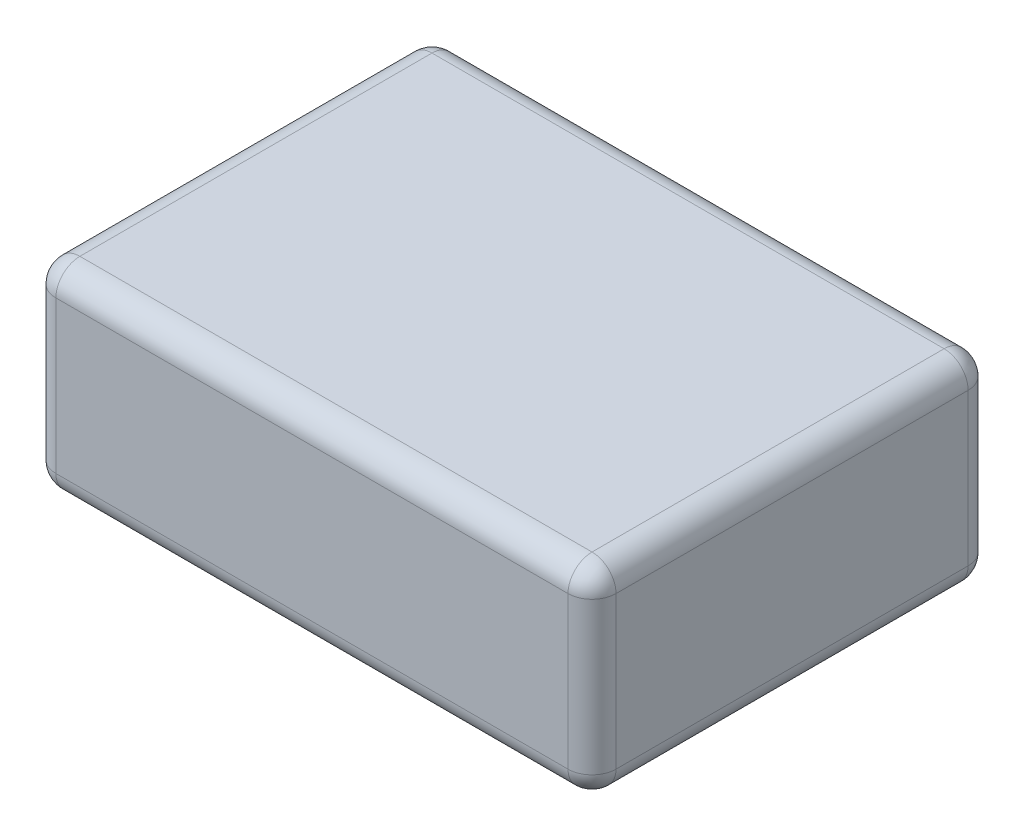
ISO-10303-21;
HEADER;
FILE_DESCRIPTION(('STEP AP214'),'2;1');
FILE_NAME('part.step','',(''),(''),'','','');
FILE_SCHEMA(('AUTOMOTIVE_DESIGN { 1 0 10303 214 1 1 1 1 }'));
ENDSEC;
DATA;
#1=APPLICATION_CONTEXT('core data for automotive mechanical design processes');
#2=APPLICATION_PROTOCOL_DEFINITION('international standard','automotive_design',2000,#1);
#3=PRODUCT_CONTEXT('',#1,'mechanical');
#4=PRODUCT('Part','Part','',(#3));
#5=PRODUCT_RELATED_PRODUCT_CATEGORY('part','',(#4));
#6=PRODUCT_DEFINITION_FORMATION('','',#4);
#7=PRODUCT_DEFINITION_CONTEXT('part definition',#1,'design');
#8=PRODUCT_DEFINITION('design','',#6,#7);
#9=PRODUCT_DEFINITION_SHAPE('','',#8);
#10=(LENGTH_UNIT() NAMED_UNIT(*) SI_UNIT(.MILLI.,.METRE.));
#11=(NAMED_UNIT(*) PLANE_ANGLE_UNIT() SI_UNIT($,.RADIAN.));
#12=(NAMED_UNIT(*) SI_UNIT($,.STERADIAN.) SOLID_ANGLE_UNIT());
#13=UNCERTAINTY_MEASURE_WITH_UNIT(LENGTH_MEASURE(1.E-05),#10,'distance_accuracy_value','');
#14=(GEOMETRIC_REPRESENTATION_CONTEXT(3) GLOBAL_UNCERTAINTY_ASSIGNED_CONTEXT((#13)) GLOBAL_UNIT_ASSIGNED_CONTEXT((#10,
#11,#12)) REPRESENTATION_CONTEXT('',''));
#15=CARTESIAN_POINT('',(0.,0.,0.));
#16=DIRECTION('',(0.,0.,1.));
#17=DIRECTION('',(1.,0.,0.));
#18=AXIS2_PLACEMENT_3D('',#15,#16,#17);
#19=CARTESIAN_POINT('',(88.9,63.5,-63.5));
#20=DIRECTION('',(-1.,0.,0.));
#21=DIRECTION('',(0.,0.,1.));
#22=AXIS2_PLACEMENT_3D('',#19,#20,#21);
#23=PLANE('',#22);
#24=DIRECTION('',(0.,-1.,0.));
#25=VECTOR('',#24,1.);
#26=CARTESIAN_POINT('',(88.9,63.5,55.88));
#27=LINE('',#26,#25);
#28=CARTESIAN_POINT('',(88.9,55.88,55.88));
#29=VERTEX_POINT('',#28);
#30=CARTESIAN_POINT('',(88.9,7.62,55.88));
#31=VERTEX_POINT('',#30);
#32=EDGE_CURVE('E180',#29,#31,#27,.T.);
#33=ORIENTED_EDGE('',*,*,#32,.T.);
#34=DIRECTION('',(0.,0.,-1.));
#35=VECTOR('',#34,1.);
#36=CARTESIAN_POINT('',(88.9,7.62,-63.5));
#37=LINE('',#36,#35);
#38=CARTESIAN_POINT('',(88.9,7.62,-55.88));
#39=VERTEX_POINT('',#38);
#40=EDGE_CURVE('E214',#31,#39,#37,.T.);
#41=ORIENTED_EDGE('',*,*,#40,.T.);
#42=DIRECTION('',(0.,-1.,0.));
#43=VECTOR('',#42,1.);
#44=CARTESIAN_POINT('',(88.9,63.5,-55.88));
#45=LINE('',#44,#43);
#46=CARTESIAN_POINT('',(88.9,55.88,-55.88));
#47=VERTEX_POINT('',#46);
#48=EDGE_CURVE('E212',#39,#47,#45,.F.);
#49=ORIENTED_EDGE('',*,*,#48,.T.);
#50=DIRECTION('',(0.,0.,-1.));
#51=VECTOR('',#50,1.);
#52=CARTESIAN_POINT('',(88.9,55.88,55.88));
#53=LINE('',#52,#51);
#54=EDGE_CURVE('E183',#47,#29,#53,.F.);
#55=ORIENTED_EDGE('',*,*,#54,.T.);
#56=EDGE_LOOP('',(#33,#41,#49,#55));
#57=FACE_BOUND('',#56,.T.);
#58=ADVANCED_FACE('F37',(#57),#23,.F.);
#59=CARTESIAN_POINT('',(-88.9,63.5,-63.5));
#60=DIRECTION('',(0.,0.,1.));
#61=DIRECTION('',(1.,0.,0.));
#62=AXIS2_PLACEMENT_3D('',#59,#60,#61);
#63=PLANE('',#62);
#64=DIRECTION('',(0.,-1.,0.));
#65=VECTOR('',#64,1.);
#66=CARTESIAN_POINT('',(81.28,63.5,-63.5));
#67=LINE('',#66,#65);
#68=CARTESIAN_POINT('',(81.28,55.88,-63.5));
#69=VERTEX_POINT('',#68);
#70=CARTESIAN_POINT('',(81.28,7.62,-63.5));
#71=VERTEX_POINT('',#70);
#72=EDGE_CURVE('E62',#69,#71,#67,.T.);
#73=ORIENTED_EDGE('',*,*,#72,.T.);
#74=DIRECTION('',(-1.,0.,0.));
#75=VECTOR('',#74,1.);
#76=CARTESIAN_POINT('',(-88.9,7.62,-63.5));
#77=LINE('',#76,#75);
#78=CARTESIAN_POINT('',(-81.28,7.62,-63.5));
#79=VERTEX_POINT('',#78);
#80=EDGE_CURVE('E46',#71,#79,#77,.T.);
#81=ORIENTED_EDGE('',*,*,#80,.T.);
#82=DIRECTION('',(0.,-1.,0.));
#83=VECTOR('',#82,1.);
#84=CARTESIAN_POINT('',(-81.28,63.5,-63.5));
#85=LINE('',#84,#83);
#86=CARTESIAN_POINT('',(-81.28,55.88,-63.5));
#87=VERTEX_POINT('',#86);
#88=EDGE_CURVE('E219',#79,#87,#85,.F.);
#89=ORIENTED_EDGE('',*,*,#88,.T.);
#90=DIRECTION('',(-1.,0.,0.));
#91=VECTOR('',#90,1.);
#92=CARTESIAN_POINT('',(81.28,55.88,-63.5));
#93=LINE('',#92,#91);
#94=EDGE_CURVE('E216',#87,#69,#93,.F.);
#95=ORIENTED_EDGE('',*,*,#94,.T.);
#96=EDGE_LOOP('',(#73,#81,#89,#95));
#97=FACE_BOUND('',#96,.T.);
#98=ADVANCED_FACE('F327',(#97),#63,.F.);
#99=CARTESIAN_POINT('',(-88.9,63.5,-63.5));
#100=DIRECTION('',(1.,0.,0.));
#101=DIRECTION('',(0.,0.,-1.));
#102=AXIS2_PLACEMENT_3D('',#99,#100,#101);
#103=PLANE('',#102);
#104=DIRECTION('',(0.,-1.,0.));
#105=VECTOR('',#104,1.);
#106=CARTESIAN_POINT('',(-88.9,63.5,-55.88));
#107=LINE('',#106,#105);
#108=CARTESIAN_POINT('',(-88.9,55.88,-55.88));
#109=VERTEX_POINT('',#108);
#110=CARTESIAN_POINT('',(-88.9,7.62,-55.88));
#111=VERTEX_POINT('',#110);
#112=EDGE_CURVE('E197',#109,#111,#107,.T.);
#113=ORIENTED_EDGE('',*,*,#112,.T.);
#114=DIRECTION('',(0.,0.,1.));
#115=VECTOR('',#114,1.);
#116=CARTESIAN_POINT('',(-88.9,7.62,-63.5));
#117=LINE('',#116,#115);
#118=CARTESIAN_POINT('',(-88.8999999999999,7.62,55.88));
#119=VERTEX_POINT('',#118);
#120=EDGE_CURVE('E199',#111,#119,#117,.T.);
#121=ORIENTED_EDGE('',*,*,#120,.T.);
#122=DIRECTION('',(0.,-1.,0.));
#123=VECTOR('',#122,1.);
#124=CARTESIAN_POINT('',(-88.8999999999999,63.5,55.88));
#125=LINE('',#124,#123);
#126=CARTESIAN_POINT('',(-88.8999999999999,55.88,55.88));
#127=VERTEX_POINT('',#126);
#128=EDGE_CURVE('E167',#119,#127,#125,.F.);
#129=ORIENTED_EDGE('',*,*,#128,.T.);
#130=DIRECTION('',(0.,0.,1.));
#131=VECTOR('',#130,1.);
#132=CARTESIAN_POINT('',(-88.9,55.88,-63.5));
#133=LINE('',#132,#131);
#134=EDGE_CURVE('E164',#127,#109,#133,.F.);
#135=ORIENTED_EDGE('',*,*,#134,.T.);
#136=EDGE_LOOP('',(#113,#121,#129,#135));
#137=FACE_BOUND('',#136,.T.);
#138=ADVANCED_FACE('F287',(#137),#103,.F.);
#139=CARTESIAN_POINT('',(-88.8999999999999,63.5,63.5));
#140=DIRECTION('',(0.,0.,-1.));
#141=DIRECTION('',(-1.,0.,0.));
#142=AXIS2_PLACEMENT_3D('',#139,#140,#141);
#143=PLANE('',#142);
#144=DIRECTION('',(0.,-1.,0.));
#145=VECTOR('',#144,1.);
#146=CARTESIAN_POINT('',(-81.2799999999999,63.5,63.5));
#147=LINE('',#146,#145);
#148=CARTESIAN_POINT('',(-81.2799999999999,55.88,63.5));
#149=VERTEX_POINT('',#148);
#150=CARTESIAN_POINT('',(-81.2799999999999,7.62,63.5));
#151=VERTEX_POINT('',#150);
#152=EDGE_CURVE('E134',#149,#151,#147,.T.);
#153=ORIENTED_EDGE('',*,*,#152,.T.);
#154=DIRECTION('',(1.,0.,0.));
#155=VECTOR('',#154,1.);
#156=CARTESIAN_POINT('',(-88.8999999999999,7.62,63.5));
#157=LINE('',#156,#155);
#158=CARTESIAN_POINT('',(81.28,7.62,63.5));
#159=VERTEX_POINT('',#158);
#160=EDGE_CURVE('E210',#151,#159,#157,.T.);
#161=ORIENTED_EDGE('',*,*,#160,.T.);
#162=DIRECTION('',(0.,-1.,0.));
#163=VECTOR('',#162,1.);
#164=CARTESIAN_POINT('',(81.28,63.5,63.5));
#165=LINE('',#164,#163);
#166=CARTESIAN_POINT('',(81.28,55.88,63.5));
#167=VERTEX_POINT('',#166);
#168=EDGE_CURVE('E136',#159,#167,#165,.F.);
#169=ORIENTED_EDGE('',*,*,#168,.T.);
#170=DIRECTION('',(1.,0.,0.));
#171=VECTOR('',#170,1.);
#172=CARTESIAN_POINT('',(-88.8999999999999,55.88,63.5));
#173=LINE('',#172,#171);
#174=EDGE_CURVE('E130',#167,#149,#173,.F.);
#175=ORIENTED_EDGE('',*,*,#174,.T.);
#176=EDGE_LOOP('',(#153,#161,#169,#175));
#177=FACE_BOUND('',#176,.T.);
#178=ADVANCED_FACE('F132',(#177),#143,.F.);
#179=CARTESIAN_POINT('',(0.,63.5,0.));
#180=DIRECTION('',(0.,1.,0.));
#181=DIRECTION('',(0.,0.,1.));
#182=AXIS2_PLACEMENT_3D('',#179,#180,#181);
#183=PLANE('',#182);
#184=DIRECTION('',(0.,0.,-1.));
#185=VECTOR('',#184,1.);
#186=CARTESIAN_POINT('',(81.28,63.5,-63.5));
#187=LINE('',#186,#185);
#188=CARTESIAN_POINT('',(81.28,63.5,55.88));
#189=VERTEX_POINT('',#188);
#190=CARTESIAN_POINT('',(81.28,63.5,-55.88));
#191=VERTEX_POINT('',#190);
#192=EDGE_CURVE('E177',#189,#191,#187,.T.);
#193=ORIENTED_EDGE('',*,*,#192,.T.);
#194=DIRECTION('',(-1.,0.,0.));
#195=VECTOR('',#194,1.);
#196=CARTESIAN_POINT('',(-81.28,63.5,-55.88));
#197=LINE('',#196,#195);
#198=CARTESIAN_POINT('',(-81.28,63.5,-55.88));
#199=VERTEX_POINT('',#198);
#200=EDGE_CURVE('E11',#191,#199,#197,.T.);
#201=ORIENTED_EDGE('',*,*,#200,.T.);
#202=DIRECTION('',(0.,0.,1.));
#203=VECTOR('',#202,1.);
#204=CARTESIAN_POINT('',(-81.2799999999999,63.5,63.5));
#205=LINE('',#204,#203);
#206=CARTESIAN_POINT('',(-81.2799999999999,63.5,55.88));
#207=VERTEX_POINT('',#206);
#208=EDGE_CURVE('E172',#199,#207,#205,.T.);
#209=ORIENTED_EDGE('',*,*,#208,.T.);
#210=DIRECTION('',(1.,0.,0.));
#211=VECTOR('',#210,1.);
#212=CARTESIAN_POINT('',(88.9,63.5,55.88));
#213=LINE('',#212,#211);
#214=EDGE_CURVE('E148',#207,#189,#213,.T.);
#215=ORIENTED_EDGE('',*,*,#214,.T.);
#216=EDGE_LOOP('',(#193,#201,#209,#215));
#217=FACE_BOUND('',#216,.T.);
#218=ADVANCED_FACE('F271',(#217),#183,.T.);
#219=CARTESIAN_POINT('',(0.,0.,0.));
#220=DIRECTION('',(0.,1.,0.));
#221=DIRECTION('',(0.,0.,1.));
#222=AXIS2_PLACEMENT_3D('',#219,#220,#221);
#223=PLANE('',#222);
#224=DIRECTION('',(1.,0.,0.));
#225=VECTOR('',#224,1.);
#226=CARTESIAN_POINT('',(0.,0.,55.88));
#227=LINE('',#226,#225);
#228=CARTESIAN_POINT('',(81.28,0.,55.88));
#229=VERTEX_POINT('',#228);
#230=CARTESIAN_POINT('',(-81.2799999999999,0.,55.88));
#231=VERTEX_POINT('',#230);
#232=EDGE_CURVE('E205',#229,#231,#227,.F.);
#233=ORIENTED_EDGE('',*,*,#232,.T.);
#234=DIRECTION('',(0.,0.,1.));
#235=VECTOR('',#234,1.);
#236=CARTESIAN_POINT('',(-81.28,0.,0.));
#237=LINE('',#236,#235);
#238=CARTESIAN_POINT('',(-81.28,0.,-55.88));
#239=VERTEX_POINT('',#238);
#240=EDGE_CURVE('E207',#231,#239,#237,.F.);
#241=ORIENTED_EDGE('',*,*,#240,.T.);
#242=DIRECTION('',(-1.,0.,0.));
#243=VECTOR('',#242,1.);
#244=CARTESIAN_POINT('',(0.,0.,-55.88));
#245=LINE('',#244,#243);
#246=CARTESIAN_POINT('',(81.28,0.,-55.88));
#247=VERTEX_POINT('',#246);
#248=EDGE_CURVE('E201',#239,#247,#245,.F.);
#249=ORIENTED_EDGE('',*,*,#248,.T.);
#250=DIRECTION('',(0.,0.,-1.));
#251=VECTOR('',#250,1.);
#252=CARTESIAN_POINT('',(81.28,0.,0.));
#253=LINE('',#252,#251);
#254=EDGE_CURVE('E203',#247,#229,#253,.F.);
#255=ORIENTED_EDGE('',*,*,#254,.T.);
#256=EDGE_LOOP('',(#233,#241,#249,#255));
#257=FACE_BOUND('',#256,.T.);
#258=ADVANCED_FACE('F341',(#257),#223,.F.);
#259=CARTESIAN_POINT('',(-81.28,55.88,0.));
#260=DIRECTION('',(0.,0.,-1.));
#261=DIRECTION('',(-1.,0.,0.));
#262=AXIS2_PLACEMENT_3D('',#259,#260,#261);
#263=CYLINDRICAL_SURFACE('',#262,7.62);
#264=ORIENTED_EDGE('',*,*,#208,.F.);
#265=CARTESIAN_POINT('',(-81.28,55.88,-55.88));
#266=DIRECTION('',(0.,0.,-1.));
#267=DIRECTION('',(-1.,0.,0.));
#268=AXIS2_PLACEMENT_3D('',#265,#266,#267);
#269=CIRCLE('',#268,7.62);
#270=EDGE_CURVE('E195',#199,#109,#269,.F.);
#271=ORIENTED_EDGE('',*,*,#270,.T.);
#272=ORIENTED_EDGE('',*,*,#134,.F.);
#273=CARTESIAN_POINT('',(-81.2799999999999,55.88,55.88));
#274=DIRECTION('',(0.,0.,1.));
#275=DIRECTION('',(1.,0.,0.));
#276=AXIS2_PLACEMENT_3D('',#273,#274,#275);
#277=CIRCLE('',#276,7.62);
#278=EDGE_CURVE('E140',#207,#127,#277,.T.);
#279=ORIENTED_EDGE('',*,*,#278,.F.);
#280=EDGE_LOOP('',(#264,#271,#272,#279));
#281=FACE_BOUND('',#280,.T.);
#282=ADVANCED_FACE('F275',(#281),#263,.T.);
#283=CARTESIAN_POINT('',(0.,55.88,55.88));
#284=DIRECTION('',(-1.,0.,0.));
#285=DIRECTION('',(0.,0.,1.));
#286=AXIS2_PLACEMENT_3D('',#283,#284,#285);
#287=CYLINDRICAL_SURFACE('',#286,7.62);
#288=ORIENTED_EDGE('',*,*,#174,.F.);
#289=CARTESIAN_POINT('',(81.28,55.88,55.88));
#290=DIRECTION('',(-1.,0.,0.));
#291=DIRECTION('',(0.,0.,1.));
#292=AXIS2_PLACEMENT_3D('',#289,#290,#291);
#293=CIRCLE('',#292,7.62);
#294=EDGE_CURVE('E173',#167,#189,#293,.T.);
#295=ORIENTED_EDGE('',*,*,#294,.T.);
#296=ORIENTED_EDGE('',*,*,#214,.F.);
#297=CARTESIAN_POINT('',(-81.2799999999999,55.88,55.88));
#298=DIRECTION('',(-1.,0.,0.));
#299=DIRECTION('',(0.,0.,1.));
#300=AXIS2_PLACEMENT_3D('',#297,#298,#299);
#301=CIRCLE('',#300,7.62);
#302=EDGE_CURVE('E144',#149,#207,#301,.T.);
#303=ORIENTED_EDGE('',*,*,#302,.F.);
#304=EDGE_LOOP('',(#288,#295,#296,#303));
#305=FACE_BOUND('',#304,.T.);
#306=ADVANCED_FACE('F146',(#305),#287,.T.);
#307=CARTESIAN_POINT('',(-81.2799999999999,55.88,55.88));
#308=DIRECTION('',(0.,1.,0.));
#309=DIRECTION('',(0.,0.,1.));
#310=AXIS2_PLACEMENT_3D('',#307,#308,#309);
#311=SPHERICAL_SURFACE('',#310,7.62);
#312=ORIENTED_EDGE('',*,*,#302,.T.);
#313=ORIENTED_EDGE('',*,*,#278,.T.);
#314=CARTESIAN_POINT('',(-81.2799999999999,55.88,55.88));
#315=DIRECTION('',(0.,1.,0.));
#316=DIRECTION('',(0.,0.,1.));
#317=AXIS2_PLACEMENT_3D('',#314,#315,#316);
#318=CIRCLE('',#317,7.62);
#319=EDGE_CURVE('E152',#149,#127,#318,.F.);
#320=ORIENTED_EDGE('',*,*,#319,.F.);
#321=EDGE_LOOP('',(#312,#313,#320));
#322=FACE_BOUND('',#321,.T.);
#323=ADVANCED_FACE('F155',(#322),#311,.T.);
#324=CARTESIAN_POINT('',(-81.2799999999999,63.5,55.88));
#325=DIRECTION('',(0.,-1.,0.));
#326=DIRECTION('',(0.,0.,-1.));
#327=AXIS2_PLACEMENT_3D('',#324,#325,#326);
#328=CYLINDRICAL_SURFACE('',#327,7.62);
#329=ORIENTED_EDGE('',*,*,#128,.F.);
#330=CARTESIAN_POINT('',(-81.2799999999999,7.62,55.88));
#331=DIRECTION('',(0.,-1.,0.));
#332=DIRECTION('',(0.,0.,-1.));
#333=AXIS2_PLACEMENT_3D('',#330,#331,#332);
#334=CIRCLE('',#333,7.62);
#335=EDGE_CURVE('E163',#119,#151,#334,.F.);
#336=ORIENTED_EDGE('',*,*,#335,.T.);
#337=ORIENTED_EDGE('',*,*,#152,.F.);
#338=ORIENTED_EDGE('',*,*,#319,.T.);
#339=EDGE_LOOP('',(#329,#336,#337,#338));
#340=FACE_BOUND('',#339,.T.);
#341=ADVANCED_FACE('F161',(#340),#328,.T.);
#342=CARTESIAN_POINT('',(81.28,55.88,0.));
#343=DIRECTION('',(0.,0.,1.));
#344=DIRECTION('',(1.,0.,0.));
#345=AXIS2_PLACEMENT_3D('',#342,#343,#344);
#346=CYLINDRICAL_SURFACE('',#345,7.62);
#347=ORIENTED_EDGE('',*,*,#54,.F.);
#348=CARTESIAN_POINT('',(81.28,55.88,-55.88));
#349=DIRECTION('',(0.,0.,1.));
#350=DIRECTION('',(1.,0.,0.));
#351=AXIS2_PLACEMENT_3D('',#348,#349,#350);
#352=CIRCLE('',#351,7.62);
#353=EDGE_CURVE('E193',#47,#191,#352,.T.);
#354=ORIENTED_EDGE('',*,*,#353,.T.);
#355=ORIENTED_EDGE('',*,*,#192,.F.);
#356=CARTESIAN_POINT('',(81.28,55.88,55.88));
#357=DIRECTION('',(0.,0.,1.));
#358=DIRECTION('',(1.,0.,0.));
#359=AXIS2_PLACEMENT_3D('',#356,#357,#358);
#360=CIRCLE('',#359,7.62);
#361=EDGE_CURVE('E158',#29,#189,#360,.T.);
#362=ORIENTED_EDGE('',*,*,#361,.F.);
#363=EDGE_LOOP('',(#347,#354,#355,#362));
#364=FACE_BOUND('',#363,.T.);
#365=ADVANCED_FACE('F268',(#364),#346,.T.);
#366=CARTESIAN_POINT('',(81.28,63.5,55.88));
#367=DIRECTION('',(0.,-1.,0.));
#368=DIRECTION('',(0.,0.,-1.));
#369=AXIS2_PLACEMENT_3D('',#366,#367,#368);
#370=CYLINDRICAL_SURFACE('',#369,7.62);
#371=ORIENTED_EDGE('',*,*,#168,.F.);
#372=CARTESIAN_POINT('',(81.28,7.62,55.88));
#373=DIRECTION('',(0.,-1.,0.));
#374=DIRECTION('',(0.,0.,-1.));
#375=AXIS2_PLACEMENT_3D('',#372,#373,#374);
#376=CIRCLE('',#375,7.62);
#377=EDGE_CURVE('E191',#159,#31,#376,.F.);
#378=ORIENTED_EDGE('',*,*,#377,.T.);
#379=ORIENTED_EDGE('',*,*,#32,.F.);
#380=CARTESIAN_POINT('',(81.28,55.88,55.88));
#381=DIRECTION('',(0.,1.,0.));
#382=DIRECTION('',(0.,0.,1.));
#383=AXIS2_PLACEMENT_3D('',#380,#381,#382);
#384=CIRCLE('',#383,7.62);
#385=EDGE_CURVE('E186',#167,#29,#384,.T.);
#386=ORIENTED_EDGE('',*,*,#385,.F.);
#387=EDGE_LOOP('',(#371,#378,#379,#386));
#388=FACE_BOUND('',#387,.T.);
#389=ADVANCED_FACE('F305',(#388),#370,.T.);
#390=CARTESIAN_POINT('',(81.28,55.88,55.88));
#391=DIRECTION('',(-1.,0.,0.));
#392=DIRECTION('',(0.,0.,1.));
#393=AXIS2_PLACEMENT_3D('',#390,#391,#392);
#394=SPHERICAL_SURFACE('',#393,7.62);
#395=ORIENTED_EDGE('',*,*,#361,.T.);
#396=ORIENTED_EDGE('',*,*,#294,.F.);
#397=ORIENTED_EDGE('',*,*,#385,.T.);
#398=EDGE_LOOP('',(#395,#396,#397));
#399=FACE_BOUND('',#398,.T.);
#400=ADVANCED_FACE('F317',(#399),#394,.T.);
#401=CARTESIAN_POINT('',(81.28,55.88,-55.88));
#402=DIRECTION('',(0.,0.,1.));
#403=DIRECTION('',(1.,0.,0.));
#404=AXIS2_PLACEMENT_3D('',#401,#402,#403);
#405=SPHERICAL_SURFACE('',#404,7.62);
#406=CARTESIAN_POINT('',(81.28,55.88,-55.88));
#407=DIRECTION('',(-1.,0.,0.));
#408=DIRECTION('',(0.,0.,1.));
#409=AXIS2_PLACEMENT_3D('',#406,#407,#408);
#410=CIRCLE('',#409,7.62);
#411=EDGE_CURVE('E252',#191,#69,#410,.T.);
#412=ORIENTED_EDGE('',*,*,#411,.F.);
#413=ORIENTED_EDGE('',*,*,#353,.F.);
#414=CARTESIAN_POINT('',(81.28,55.88,-55.88));
#415=DIRECTION('',(0.,-1.,0.));
#416=DIRECTION('',(0.,0.,-1.));
#417=AXIS2_PLACEMENT_3D('',#414,#415,#416);
#418=CIRCLE('',#417,7.62);
#419=EDGE_CURVE('E41',#69,#47,#418,.T.);
#420=ORIENTED_EDGE('',*,*,#419,.F.);
#421=EDGE_LOOP('',(#412,#413,#420));
#422=FACE_BOUND('',#421,.T.);
#423=ADVANCED_FACE('F39',(#422),#405,.T.);
#424=CARTESIAN_POINT('',(81.28,63.5,-55.88));
#425=DIRECTION('',(0.,-1.,0.));
#426=DIRECTION('',(0.,0.,-1.));
#427=AXIS2_PLACEMENT_3D('',#424,#425,#426);
#428=CYLINDRICAL_SURFACE('',#427,7.62);
#429=ORIENTED_EDGE('',*,*,#419,.T.);
#430=ORIENTED_EDGE('',*,*,#48,.F.);
#431=CARTESIAN_POINT('',(81.28,7.62,-55.88));
#432=DIRECTION('',(0.,-1.,0.));
#433=DIRECTION('',(0.,0.,-1.));
#434=AXIS2_PLACEMENT_3D('',#431,#432,#433);
#435=CIRCLE('',#434,7.62);
#436=EDGE_CURVE('E250',#71,#39,#435,.T.);
#437=ORIENTED_EDGE('',*,*,#436,.F.);
#438=ORIENTED_EDGE('',*,*,#72,.F.);
#439=EDGE_LOOP('',(#429,#430,#437,#438));
#440=FACE_BOUND('',#439,.T.);
#441=ADVANCED_FACE('F262',(#440),#428,.T.);
#442=CARTESIAN_POINT('',(0.,55.88,-55.88));
#443=DIRECTION('',(1.,0.,0.));
#444=DIRECTION('',(0.,0.,-1.));
#445=AXIS2_PLACEMENT_3D('',#442,#443,#444);
#446=CYLINDRICAL_SURFACE('',#445,7.62);
#447=ORIENTED_EDGE('',*,*,#411,.T.);
#448=ORIENTED_EDGE('',*,*,#94,.F.);
#449=CARTESIAN_POINT('',(-81.28,55.88,-55.88));
#450=DIRECTION('',(-1.,0.,0.));
#451=DIRECTION('',(0.,0.,1.));
#452=AXIS2_PLACEMENT_3D('',#449,#450,#451);
#453=CIRCLE('',#452,7.62);
#454=EDGE_CURVE('E247',#199,#87,#453,.T.);
#455=ORIENTED_EDGE('',*,*,#454,.F.);
#456=ORIENTED_EDGE('',*,*,#200,.F.);
#457=EDGE_LOOP('',(#447,#448,#455,#456));
#458=FACE_BOUND('',#457,.T.);
#459=ADVANCED_FACE('F278',(#458),#446,.T.);
#460=CARTESIAN_POINT('',(81.28,7.62,-55.88));
#461=DIRECTION('',(1.,0.,0.));
#462=DIRECTION('',(0.,1.,0.));
#463=AXIS2_PLACEMENT_3D('',#460,#461,#462);
#464=SPHERICAL_SURFACE('',#463,7.62);
#465=CARTESIAN_POINT('',(81.28,7.62,-55.88));
#466=DIRECTION('',(1.,0.,0.));
#467=DIRECTION('',(0.,0.,-1.));
#468=AXIS2_PLACEMENT_3D('',#465,#466,#467);
#469=CIRCLE('',#468,7.62);
#470=EDGE_CURVE('E241',#71,#247,#469,.F.);
#471=ORIENTED_EDGE('',*,*,#470,.F.);
#472=ORIENTED_EDGE('',*,*,#436,.T.);
#473=CARTESIAN_POINT('',(81.28,7.62,-55.88));
#474=DIRECTION('',(0.,0.,-1.));
#475=DIRECTION('',(-1.,0.,0.));
#476=AXIS2_PLACEMENT_3D('',#473,#474,#475);
#477=CIRCLE('',#476,7.62);
#478=EDGE_CURVE('E244',#247,#39,#477,.F.);
#479=ORIENTED_EDGE('',*,*,#478,.F.);
#480=EDGE_LOOP('',(#471,#472,#479));
#481=FACE_BOUND('',#480,.T.);
#482=ADVANCED_FACE('F419',(#481),#464,.T.);
#483=CARTESIAN_POINT('',(-81.28,55.88,-55.88));
#484=DIRECTION('',(0.,0.,1.));
#485=DIRECTION('',(1.,0.,0.));
#486=AXIS2_PLACEMENT_3D('',#483,#484,#485);
#487=SPHERICAL_SURFACE('',#486,7.62);
#488=ORIENTED_EDGE('',*,*,#270,.F.);
#489=ORIENTED_EDGE('',*,*,#454,.T.);
#490=CARTESIAN_POINT('',(-81.28,55.88,-55.88));
#491=DIRECTION('',(0.,-1.,0.));
#492=DIRECTION('',(0.,0.,-1.));
#493=AXIS2_PLACEMENT_3D('',#490,#491,#492);
#494=CIRCLE('',#493,7.62);
#495=EDGE_CURVE('E238',#109,#87,#494,.T.);
#496=ORIENTED_EDGE('',*,*,#495,.F.);
#497=EDGE_LOOP('',(#488,#489,#496));
#498=FACE_BOUND('',#497,.T.);
#499=ADVANCED_FACE('F281',(#498),#487,.T.);
#500=CARTESIAN_POINT('',(81.28,7.62,-63.5));
#501=DIRECTION('',(0.,0.,-1.));
#502=DIRECTION('',(-1.,0.,0.));
#503=AXIS2_PLACEMENT_3D('',#500,#501,#502);
#504=CYLINDRICAL_SURFACE('',#503,7.62);
#505=ORIENTED_EDGE('',*,*,#478,.T.);
#506=ORIENTED_EDGE('',*,*,#40,.F.);
#507=CARTESIAN_POINT('',(81.28,7.62,55.88));
#508=DIRECTION('',(0.,0.,1.));
#509=DIRECTION('',(1.,0.,0.));
#510=AXIS2_PLACEMENT_3D('',#507,#508,#509);
#511=CIRCLE('',#510,7.62);
#512=EDGE_CURVE('E235',#229,#31,#511,.T.);
#513=ORIENTED_EDGE('',*,*,#512,.F.);
#514=ORIENTED_EDGE('',*,*,#254,.F.);
#515=EDGE_LOOP('',(#505,#506,#513,#514));
#516=FACE_BOUND('',#515,.T.);
#517=ADVANCED_FACE('F313',(#516),#504,.T.);
#518=CARTESIAN_POINT('',(-88.9,7.62,-55.88));
#519=DIRECTION('',(-1.,0.,0.));
#520=DIRECTION('',(0.,0.,1.));
#521=AXIS2_PLACEMENT_3D('',#518,#519,#520);
#522=CYLINDRICAL_SURFACE('',#521,7.62);
#523=ORIENTED_EDGE('',*,*,#470,.T.);
#524=ORIENTED_EDGE('',*,*,#248,.F.);
#525=CARTESIAN_POINT('',(-81.28,7.62,-55.88));
#526=DIRECTION('',(-1.,0.,0.));
#527=DIRECTION('',(0.,0.,1.));
#528=AXIS2_PLACEMENT_3D('',#525,#526,#527);
#529=CIRCLE('',#528,7.62);
#530=EDGE_CURVE('E233',#79,#239,#529,.T.);
#531=ORIENTED_EDGE('',*,*,#530,.F.);
#532=ORIENTED_EDGE('',*,*,#80,.F.);
#533=EDGE_LOOP('',(#523,#524,#531,#532));
#534=FACE_BOUND('',#533,.T.);
#535=ADVANCED_FACE('F446',(#534),#522,.T.);
#536=CARTESIAN_POINT('',(-81.28,63.5,-55.88));
#537=DIRECTION('',(0.,-1.,0.));
#538=DIRECTION('',(0.,0.,-1.));
#539=AXIS2_PLACEMENT_3D('',#536,#537,#538);
#540=CYLINDRICAL_SURFACE('',#539,7.62);
#541=ORIENTED_EDGE('',*,*,#495,.T.);
#542=ORIENTED_EDGE('',*,*,#88,.F.);
#543=CARTESIAN_POINT('',(-81.28,7.62,-55.88));
#544=DIRECTION('',(0.,-1.,0.));
#545=DIRECTION('',(0.,0.,-1.));
#546=AXIS2_PLACEMENT_3D('',#543,#544,#545);
#547=CIRCLE('',#546,7.62);
#548=EDGE_CURVE('E54',#111,#79,#547,.T.);
#549=ORIENTED_EDGE('',*,*,#548,.F.);
#550=ORIENTED_EDGE('',*,*,#112,.F.);
#551=EDGE_LOOP('',(#541,#542,#549,#550));
#552=FACE_BOUND('',#551,.T.);
#553=ADVANCED_FACE('F285',(#552),#540,.T.);
#554=CARTESIAN_POINT('',(81.28,7.62,55.88));
#555=DIRECTION('',(0.,1.,0.));
#556=DIRECTION('',(0.,0.,1.));
#557=AXIS2_PLACEMENT_3D('',#554,#555,#556);
#558=SPHERICAL_SURFACE('',#557,7.62);
#559=ORIENTED_EDGE('',*,*,#512,.T.);
#560=ORIENTED_EDGE('',*,*,#377,.F.);
#561=CARTESIAN_POINT('',(81.28,7.62,55.88));
#562=DIRECTION('',(-1.,0.,0.));
#563=DIRECTION('',(0.,0.,1.));
#564=AXIS2_PLACEMENT_3D('',#561,#562,#563);
#565=CIRCLE('',#564,7.62);
#566=EDGE_CURVE('E229',#229,#159,#565,.T.);
#567=ORIENTED_EDGE('',*,*,#566,.F.);
#568=EDGE_LOOP('',(#559,#560,#567));
#569=FACE_BOUND('',#568,.T.);
#570=ADVANCED_FACE('F308',(#569),#558,.T.);
#571=CARTESIAN_POINT('',(-81.28,7.62,-55.88));
#572=DIRECTION('',(0.,0.,-1.));
#573=DIRECTION('',(0.,1.,0.));
#574=AXIS2_PLACEMENT_3D('',#571,#572,#573);
#575=SPHERICAL_SURFACE('',#574,7.62);
#576=ORIENTED_EDGE('',*,*,#548,.T.);
#577=ORIENTED_EDGE('',*,*,#530,.T.);
#578=CARTESIAN_POINT('',(-81.28,7.62,-55.88));
#579=DIRECTION('',(0.,0.,-1.));
#580=DIRECTION('',(-1.,0.,0.));
#581=AXIS2_PLACEMENT_3D('',#578,#579,#580);
#582=CIRCLE('',#581,7.62);
#583=EDGE_CURVE('E227',#111,#239,#582,.F.);
#584=ORIENTED_EDGE('',*,*,#583,.F.);
#585=EDGE_LOOP('',(#576,#577,#584));
#586=FACE_BOUND('',#585,.T.);
#587=ADVANCED_FACE('F472',(#586),#575,.T.);
#588=CARTESIAN_POINT('',(-88.8999999999999,7.62,55.88));
#589=DIRECTION('',(1.,0.,0.));
#590=DIRECTION('',(0.,0.,-1.));
#591=AXIS2_PLACEMENT_3D('',#588,#589,#590);
#592=CYLINDRICAL_SURFACE('',#591,7.62);
#593=ORIENTED_EDGE('',*,*,#566,.T.);
#594=ORIENTED_EDGE('',*,*,#160,.F.);
#595=CARTESIAN_POINT('',(-81.2799999999999,7.62,55.88));
#596=DIRECTION('',(-1.,0.,0.));
#597=DIRECTION('',(0.,0.,1.));
#598=AXIS2_PLACEMENT_3D('',#595,#596,#597);
#599=CIRCLE('',#598,7.62);
#600=EDGE_CURVE('E225',#231,#151,#599,.T.);
#601=ORIENTED_EDGE('',*,*,#600,.F.);
#602=ORIENTED_EDGE('',*,*,#232,.F.);
#603=EDGE_LOOP('',(#593,#594,#601,#602));
#604=FACE_BOUND('',#603,.T.);
#605=ADVANCED_FACE('F300',(#604),#592,.T.);
#606=CARTESIAN_POINT('',(-81.28,7.62,-63.5));
#607=DIRECTION('',(0.,0.,1.));
#608=DIRECTION('',(1.,0.,0.));
#609=AXIS2_PLACEMENT_3D('',#606,#607,#608);
#610=CYLINDRICAL_SURFACE('',#609,7.62);
#611=ORIENTED_EDGE('',*,*,#583,.T.);
#612=ORIENTED_EDGE('',*,*,#240,.F.);
#613=CARTESIAN_POINT('',(-81.2799999999999,7.62,55.88));
#614=DIRECTION('',(0.,0.,1.));
#615=DIRECTION('',(1.,0.,0.));
#616=AXIS2_PLACEMENT_3D('',#613,#614,#615);
#617=CIRCLE('',#616,7.62);
#618=EDGE_CURVE('E222',#119,#231,#617,.T.);
#619=ORIENTED_EDGE('',*,*,#618,.F.);
#620=ORIENTED_EDGE('',*,*,#120,.F.);
#621=EDGE_LOOP('',(#611,#612,#619,#620));
#622=FACE_BOUND('',#621,.T.);
#623=ADVANCED_FACE('F296',(#622),#610,.T.);
#624=CARTESIAN_POINT('',(-81.2799999999999,7.62,55.88));
#625=DIRECTION('',(0.,1.,0.));
#626=DIRECTION('',(0.,0.,1.));
#627=AXIS2_PLACEMENT_3D('',#624,#625,#626);
#628=SPHERICAL_SURFACE('',#627,7.62);
#629=ORIENTED_EDGE('',*,*,#600,.T.);
#630=ORIENTED_EDGE('',*,*,#335,.F.);
#631=ORIENTED_EDGE('',*,*,#618,.T.);
#632=EDGE_LOOP('',(#629,#630,#631));
#633=FACE_BOUND('',#632,.T.);
#634=ADVANCED_FACE('F291',(#633),#628,.T.);
#635=CLOSED_SHELL('',(#58,#98,#138,#178,#218,#258,#282,#306,#323,#341,#365,#389,#400,#423,#441,
#459,#482,#499,#517,#535,#553,#570,#587,#605,#623,#634));
#636=MANIFOLD_SOLID_BREP('B2',#635);
#637=ADVANCED_BREP_SHAPE_REPRESENTATION('',(#18,#636),#14);
#638=SHAPE_DEFINITION_REPRESENTATION(#9,#637);
ENDSEC;
END-ISO-10303-21;
